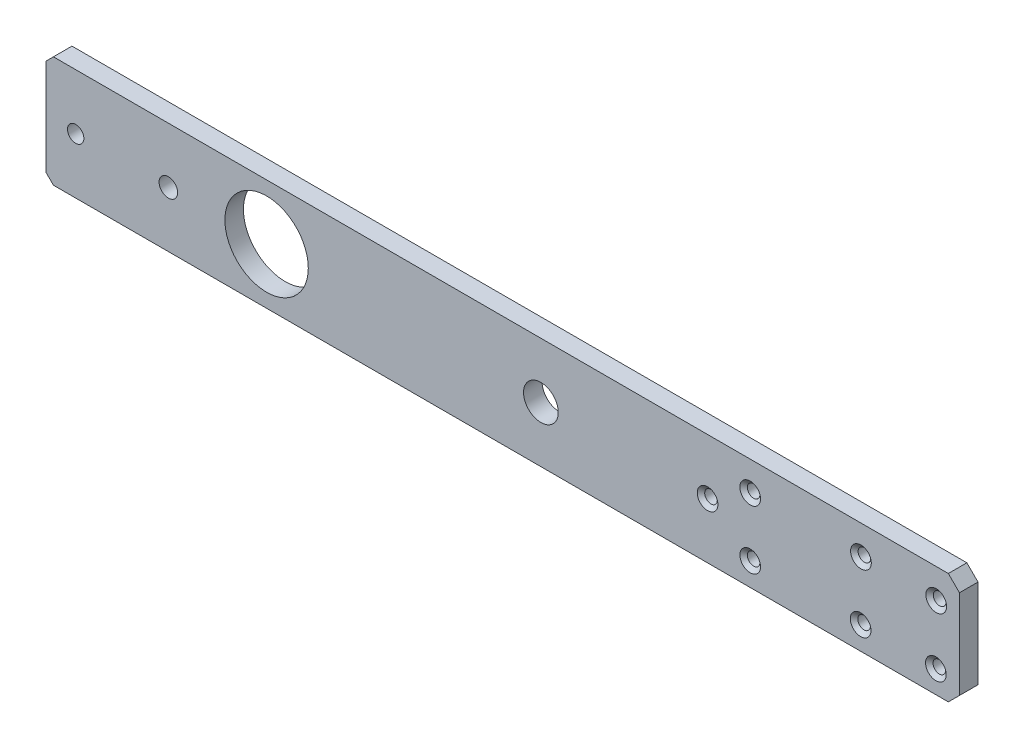
ISO-10303-21;
HEADER;
FILE_DESCRIPTION(('STEP AP214'),'2;1');
FILE_NAME('part.step','',(''),(''),'','','');
FILE_SCHEMA(('AUTOMOTIVE_DESIGN { 1 0 10303 214 1 1 1 1 }'));
ENDSEC;
DATA;
#1=APPLICATION_CONTEXT('core data for automotive mechanical design processes');
#2=APPLICATION_PROTOCOL_DEFINITION('international standard','automotive_design',2000,#1);
#3=PRODUCT_CONTEXT('',#1,'mechanical');
#4=PRODUCT('Part','Part','',(#3));
#5=PRODUCT_RELATED_PRODUCT_CATEGORY('part','',(#4));
#6=PRODUCT_DEFINITION_FORMATION('','',#4);
#7=PRODUCT_DEFINITION_CONTEXT('part definition',#1,'design');
#8=PRODUCT_DEFINITION('design','',#6,#7);
#9=PRODUCT_DEFINITION_SHAPE('','',#8);
#10=(LENGTH_UNIT() NAMED_UNIT(*) SI_UNIT(.MILLI.,.METRE.));
#11=(NAMED_UNIT(*) PLANE_ANGLE_UNIT() SI_UNIT($,.RADIAN.));
#12=(NAMED_UNIT(*) SI_UNIT($,.STERADIAN.) SOLID_ANGLE_UNIT());
#13=UNCERTAINTY_MEASURE_WITH_UNIT(LENGTH_MEASURE(1.E-05),#10,'distance_accuracy_value','');
#14=(GEOMETRIC_REPRESENTATION_CONTEXT(3) GLOBAL_UNCERTAINTY_ASSIGNED_CONTEXT((#13)) GLOBAL_UNIT_ASSIGNED_CONTEXT((#10,
#11,#12)) REPRESENTATION_CONTEXT('',''));
#15=CARTESIAN_POINT('',(0.,0.,0.));
#16=DIRECTION('',(0.,0.,1.));
#17=DIRECTION('',(1.,0.,0.));
#18=AXIS2_PLACEMENT_3D('',#15,#16,#17);
#19=CARTESIAN_POINT('',(0.,0.,3.175));
#20=DIRECTION('',(0.,0.,-1.));
#21=DIRECTION('',(-1.,0.,0.));
#22=AXIS2_PLACEMENT_3D('',#19,#20,#21);
#23=PLANE('',#22);
#24=CARTESIAN_POINT('',(93.9672182120003,0.,3.175));
#25=DIRECTION('',(0.,0.,-1.));
#26=DIRECTION('',(-1.,0.,0.));
#27=AXIS2_PLACEMENT_3D('',#24,#25,#26);
#28=CIRCLE('',#27,5.953125);
#29=CARTESIAN_POINT('',(88.0140932120003,0.,3.175));
#30=VERTEX_POINT('',#29);
#31=EDGE_CURVE('E625',#30,#30,#28,.T.);
#32=ORIENTED_EDGE('',*,*,#31,.T.);
#33=EDGE_LOOP('',(#32));
#34=FACE_BOUND('',#33,.T.);
#35=CARTESIAN_POINT('',(-33.6549999999997,0.,3.175));
#36=DIRECTION('',(0.,0.,-1.));
#37=DIRECTION('',(-1.,0.,0.));
#38=AXIS2_PLACEMENT_3D('',#35,#36,#37);
#39=CIRCLE('',#38,3.175);
#40=CARTESIAN_POINT('',(-36.8299999999997,0.,3.175));
#41=VERTEX_POINT('',#40);
#42=EDGE_CURVE('E616',#41,#41,#39,.T.);
#43=ORIENTED_EDGE('',*,*,#42,.T.);
#44=EDGE_LOOP('',(#43));
#45=FACE_BOUND('',#44,.T.);
#46=CARTESIAN_POINT('',(-65.4049999999997,0.,3.175));
#47=DIRECTION('',(0.,0.,-1.));
#48=DIRECTION('',(-1.,0.,0.));
#49=AXIS2_PLACEMENT_3D('',#46,#47,#48);
#50=CIRCLE('',#49,2.8067);
#51=CARTESIAN_POINT('',(-68.2116999999997,0.,3.175));
#52=VERTEX_POINT('',#51);
#53=EDGE_CURVE('E170',#52,#52,#50,.T.);
#54=ORIENTED_EDGE('',*,*,#53,.T.);
#55=EDGE_LOOP('',(#54));
#56=FACE_BOUND('',#55,.T.);
#57=CARTESIAN_POINT('',(203.608782335042,8.99137535087546,3.175));
#58=DIRECTION('',(0.,0.,1.));
#59=DIRECTION('',(1.,0.,0.));
#60=AXIS2_PLACEMENT_3D('',#57,#58,#59);
#61=CIRCLE('',#60,3.5433);
#62=CARTESIAN_POINT('',(207.152082335042,8.99137535087546,3.175));
#63=VERTEX_POINT('',#62);
#64=EDGE_CURVE('E172',#63,#63,#61,.T.);
#65=ORIENTED_EDGE('',*,*,#64,.F.);
#66=EDGE_LOOP('',(#65));
#67=FACE_BOUND('',#66,.T.);
#68=CARTESIAN_POINT('',(203.503161764145,-11.1439269688226,3.175));
#69=DIRECTION('',(0.,0.,1.));
#70=DIRECTION('',(1.,0.,0.));
#71=AXIS2_PLACEMENT_3D('',#68,#69,#70);
#72=CIRCLE('',#71,3.5433);
#73=CARTESIAN_POINT('',(207.046461764145,-11.1439269688226,3.175));
#74=VERTEX_POINT('',#73);
#75=EDGE_CURVE('E183',#74,#74,#72,.T.);
#76=ORIENTED_EDGE('',*,*,#75,.F.);
#77=EDGE_LOOP('',(#76));
#78=FACE_BOUND('',#77,.T.);
#79=CARTESIAN_POINT('',(229.282371238552,-11.3467989682312,3.175));
#80=DIRECTION('',(0.,0.,1.));
#81=DIRECTION('',(1.,0.,0.));
#82=AXIS2_PLACEMENT_3D('',#79,#80,#81);
#83=CIRCLE('',#82,3.5433);
#84=CARTESIAN_POINT('',(232.825671238552,-11.3467989682312,3.175));
#85=VERTEX_POINT('',#84);
#86=EDGE_CURVE('E189',#85,#85,#83,.T.);
#87=ORIENTED_EDGE('',*,*,#86,.F.);
#88=EDGE_LOOP('',(#87));
#89=FACE_BOUND('',#88,.T.);
#90=CARTESIAN_POINT('',(229.388701470581,8.92379178362501,3.175));
#91=DIRECTION('',(0.,0.,1.));
#92=DIRECTION('',(1.,0.,0.));
#93=AXIS2_PLACEMENT_3D('',#90,#91,#92);
#94=CIRCLE('',#93,3.5433);
#95=CARTESIAN_POINT('',(232.932001470581,8.92379178362501,3.175));
#96=VERTEX_POINT('',#95);
#97=EDGE_CURVE('E195',#96,#96,#94,.T.);
#98=ORIENTED_EDGE('',*,*,#97,.F.);
#99=EDGE_LOOP('',(#98));
#100=FACE_BOUND('',#99,.T.);
#101=CARTESIAN_POINT('',(165.672159691465,8.99137535087824,3.175));
#102=DIRECTION('',(0.,0.,1.));
#103=DIRECTION('',(1.,0.,0.));
#104=AXIS2_PLACEMENT_3D('',#101,#102,#103);
#105=CIRCLE('',#104,3.5433);
#106=CARTESIAN_POINT('',(169.215459691465,8.99137535087824,3.175));
#107=VERTEX_POINT('',#106);
#108=EDGE_CURVE('E201',#107,#107,#105,.T.);
#109=ORIENTED_EDGE('',*,*,#108,.F.);
#110=EDGE_LOOP('',(#109));
#111=FACE_BOUND('',#110,.T.);
#112=CARTESIAN_POINT('',(165.672159691465,-11.1439269688198,3.175));
#113=DIRECTION('',(0.,0.,1.));
#114=DIRECTION('',(1.,0.,0.));
#115=AXIS2_PLACEMENT_3D('',#112,#113,#114);
#116=CIRCLE('',#115,3.5433);
#117=CARTESIAN_POINT('',(169.215459691465,-11.1439269688198,3.175));
#118=VERTEX_POINT('',#117);
#119=EDGE_CURVE('E207',#118,#118,#116,.T.);
#120=ORIENTED_EDGE('',*,*,#119,.F.);
#121=EDGE_LOOP('',(#120));
#122=FACE_BOUND('',#121,.T.);
#123=CARTESIAN_POINT('',(151.067159691465,2.83106871279415E-12,3.175));
#124=DIRECTION('',(0.,0.,1.));
#125=DIRECTION('',(1.,0.,0.));
#126=AXIS2_PLACEMENT_3D('',#123,#124,#125);
#127=CIRCLE('',#126,3.5433);
#128=CARTESIAN_POINT('',(154.610459691465,2.83106871279415E-12,3.175));
#129=VERTEX_POINT('',#128);
#130=EDGE_CURVE('E213',#129,#129,#127,.T.);
#131=ORIENTED_EDGE('',*,*,#130,.F.);
#132=EDGE_LOOP('',(#131));
#133=FACE_BOUND('',#132,.T.);
#134=DIRECTION('',(-1.,0.,0.));
#135=VECTOR('',#134,1.);
#136=CARTESIAN_POINT('',(0.,19.05,3.175));
#137=LINE('',#136,#135);
#138=CARTESIAN_POINT('',(233.542085197356,19.0500000000001,3.175));
#139=VERTEX_POINT('',#138);
#140=CARTESIAN_POINT('',(-73.0249999999997,19.05,3.175));
#141=VERTEX_POINT('',#140);
#142=EDGE_CURVE('E119',#139,#141,#137,.T.);
#143=ORIENTED_EDGE('',*,*,#142,.T.);
#144=DIRECTION('',(-0.707106781186544,-0.707106781186551,0.));
#145=VECTOR('',#144,1.);
#146=CARTESIAN_POINT('',(-73.0249999999997,19.05,3.175));
#147=LINE('',#146,#145);
#148=CARTESIAN_POINT('',(-75.5649999999997,16.51,3.175));
#149=VERTEX_POINT('',#148);
#150=EDGE_CURVE('E142',#141,#149,#147,.T.);
#151=ORIENTED_EDGE('',*,*,#150,.T.);
#152=DIRECTION('',(0.,-1.,0.));
#153=VECTOR('',#152,1.);
#154=CARTESIAN_POINT('',(-75.5649999999997,19.05,3.175));
#155=LINE('',#154,#153);
#156=CARTESIAN_POINT('',(-75.5649999999997,-16.51,3.175));
#157=VERTEX_POINT('',#156);
#158=EDGE_CURVE('E166',#149,#157,#155,.T.);
#159=ORIENTED_EDGE('',*,*,#158,.T.);
#160=DIRECTION('',(0.707106781186551,-0.707106781186544,0.));
#161=VECTOR('',#160,1.);
#162=CARTESIAN_POINT('',(-75.5649999999997,-16.51,3.175));
#163=LINE('',#162,#161);
#164=CARTESIAN_POINT('',(-73.0249999999996,-19.05,3.175));
#165=VERTEX_POINT('',#164);
#166=EDGE_CURVE('E140',#157,#165,#163,.T.);
#167=ORIENTED_EDGE('',*,*,#166,.T.);
#168=DIRECTION('',(1.,0.,0.));
#169=VECTOR('',#168,1.);
#170=CARTESIAN_POINT('',(-28.5749999999997,-19.05,3.175));
#171=LINE('',#170,#169);
#172=CARTESIAN_POINT('',(233.542085197356,-19.05,3.175));
#173=VERTEX_POINT('',#172);
#174=EDGE_CURVE('E122',#165,#173,#171,.T.);
#175=ORIENTED_EDGE('',*,*,#174,.T.);
#176=DIRECTION('',(-0.707106781186548,-0.707106781186547,0.));
#177=VECTOR('',#176,1.);
#178=CARTESIAN_POINT('',(233.542085197356,-19.05,3.175));
#179=LINE('',#178,#177);
#180=CARTESIAN_POINT('',(237.352085197356,-15.24,3.175));
#181=VERTEX_POINT('',#180);
#182=EDGE_CURVE('E118',#173,#181,#179,.F.);
#183=ORIENTED_EDGE('',*,*,#182,.T.);
#184=DIRECTION('',(0.,-1.,0.));
#185=VECTOR('',#184,1.);
#186=CARTESIAN_POINT('',(237.352085197356,19.0500000000001,3.175));
#187=LINE('',#186,#185);
#188=CARTESIAN_POINT('',(237.352085197356,15.24,3.175));
#189=VERTEX_POINT('',#188);
#190=EDGE_CURVE('E219',#189,#181,#187,.T.);
#191=ORIENTED_EDGE('',*,*,#190,.F.);
#192=DIRECTION('',(0.707106781186547,-0.707106781186548,0.));
#193=VECTOR('',#192,1.);
#194=CARTESIAN_POINT('',(237.352085197356,15.24,3.175));
#195=LINE('',#194,#193);
#196=EDGE_CURVE('E128',#189,#139,#195,.F.);
#197=ORIENTED_EDGE('',*,*,#196,.T.);
#198=EDGE_LOOP('',(#143,#151,#159,#167,#175,#183,#191,#197));
#199=FACE_BOUND('',#198,.T.);
#200=CARTESIAN_POINT('',(0.,0.,3.175));
#201=DIRECTION('',(0.,0.,1.));
#202=DIRECTION('',(1.,0.,0.));
#203=AXIS2_PLACEMENT_3D('',#200,#201,#202);
#204=CIRCLE('',#203,14.2875);
#205=CARTESIAN_POINT('',(14.2875,0.,3.175));
#206=VERTEX_POINT('',#205);
#207=EDGE_CURVE('E103',#206,#206,#204,.T.);
#208=ORIENTED_EDGE('',*,*,#207,.F.);
#209=EDGE_LOOP('',(#208));
#210=FACE_BOUND('',#209,.T.);
#211=ADVANCED_FACE('F34',(#34,#45,#56,#67,#78,#89,#100,#111,#122,#133,#199,#210),#23,.F.);
#212=CARTESIAN_POINT('',(0.,0.,-3.175));
#213=DIRECTION('',(0.,0.,-1.));
#214=DIRECTION('',(-1.,0.,0.));
#215=AXIS2_PLACEMENT_3D('',#212,#213,#214);
#216=PLANE('',#215);
#217=CARTESIAN_POINT('',(93.9672182120003,0.,-3.175));
#218=DIRECTION('',(0.,0.,-1.));
#219=DIRECTION('',(-1.,0.,0.));
#220=AXIS2_PLACEMENT_3D('',#217,#218,#219);
#221=CIRCLE('',#220,5.953125);
#222=CARTESIAN_POINT('',(88.0140932120003,0.,-3.175));
#223=VERTEX_POINT('',#222);
#224=EDGE_CURVE('E627',#223,#223,#221,.T.);
#225=ORIENTED_EDGE('',*,*,#224,.F.);
#226=EDGE_LOOP('',(#225));
#227=FACE_BOUND('',#226,.T.);
#228=CARTESIAN_POINT('',(-33.6549999999997,0.,-3.175));
#229=DIRECTION('',(0.,0.,-1.));
#230=DIRECTION('',(-1.,0.,0.));
#231=AXIS2_PLACEMENT_3D('',#228,#229,#230);
#232=CIRCLE('',#231,3.175);
#233=CARTESIAN_POINT('',(-36.8299999999997,0.,-3.175));
#234=VERTEX_POINT('',#233);
#235=EDGE_CURVE('E620',#234,#234,#232,.T.);
#236=ORIENTED_EDGE('',*,*,#235,.F.);
#237=EDGE_LOOP('',(#236));
#238=FACE_BOUND('',#237,.T.);
#239=CARTESIAN_POINT('',(-65.4049999999997,0.,-3.175));
#240=DIRECTION('',(0.,0.,-1.));
#241=DIRECTION('',(-1.,0.,0.));
#242=AXIS2_PLACEMENT_3D('',#239,#240,#241);
#243=CIRCLE('',#242,4.8895);
#244=CARTESIAN_POINT('',(-70.2944999999996,0.,-3.175));
#245=VERTEX_POINT('',#244);
#246=EDGE_CURVE('E614',#245,#245,#243,.T.);
#247=ORIENTED_EDGE('',*,*,#246,.F.);
#248=EDGE_LOOP('',(#247));
#249=FACE_BOUND('',#248,.T.);
#250=DIRECTION('',(0.,-1.,0.));
#251=VECTOR('',#250,1.);
#252=CARTESIAN_POINT('',(-75.5649999999997,19.05,-3.175));
#253=LINE('',#252,#251);
#254=CARTESIAN_POINT('',(-75.5649999999997,16.51,-3.175));
#255=VERTEX_POINT('',#254);
#256=CARTESIAN_POINT('',(-75.5649999999997,-16.51,-3.175));
#257=VERTEX_POINT('',#256);
#258=EDGE_CURVE('E153',#255,#257,#253,.T.);
#259=ORIENTED_EDGE('',*,*,#258,.F.);
#260=DIRECTION('',(0.707106781186544,0.707106781186551,0.));
#261=VECTOR('',#260,1.);
#262=CARTESIAN_POINT('',(-46.0375000000002,46.0374999999997,-3.175));
#263=LINE('',#262,#261);
#264=CARTESIAN_POINT('',(-73.0249999999997,19.05,-3.175));
#265=VERTEX_POINT('',#264);
#266=EDGE_CURVE('E42',#255,#265,#263,.T.);
#267=ORIENTED_EDGE('',*,*,#266,.T.);
#268=DIRECTION('',(-1.,0.,0.));
#269=VECTOR('',#268,1.);
#270=CARTESIAN_POINT('',(0.,19.05,-3.175));
#271=LINE('',#270,#269);
#272=CARTESIAN_POINT('',(233.542085197356,19.0500000000001,-3.175));
#273=VERTEX_POINT('',#272);
#274=EDGE_CURVE('E102',#273,#265,#271,.T.);
#275=ORIENTED_EDGE('',*,*,#274,.F.);
#276=DIRECTION('',(-0.707106781186547,0.707106781186548,0.));
#277=VECTOR('',#276,1.);
#278=CARTESIAN_POINT('',(126.296042598678,126.296042598678,-3.175));
#279=LINE('',#278,#277);
#280=CARTESIAN_POINT('',(237.352085197356,15.24,-3.175));
#281=VERTEX_POINT('',#280);
#282=EDGE_CURVE('E114',#273,#281,#279,.F.);
#283=ORIENTED_EDGE('',*,*,#282,.T.);
#284=DIRECTION('',(0.,-1.,0.));
#285=VECTOR('',#284,1.);
#286=CARTESIAN_POINT('',(237.352085197356,19.0500000000001,-3.175));
#287=LINE('',#286,#285);
#288=CARTESIAN_POINT('',(237.352085197356,-15.24,-3.175));
#289=VERTEX_POINT('',#288);
#290=EDGE_CURVE('E111',#281,#289,#287,.T.);
#291=ORIENTED_EDGE('',*,*,#290,.T.);
#292=DIRECTION('',(0.707106781186548,0.707106781186547,0.));
#293=VECTOR('',#292,1.);
#294=CARTESIAN_POINT('',(126.296042598678,-126.296042598678,-3.175));
#295=LINE('',#294,#293);
#296=CARTESIAN_POINT('',(233.542085197356,-19.05,-3.175));
#297=VERTEX_POINT('',#296);
#298=EDGE_CURVE('E107',#289,#297,#295,.F.);
#299=ORIENTED_EDGE('',*,*,#298,.T.);
#300=DIRECTION('',(1.,0.,0.));
#301=VECTOR('',#300,1.);
#302=CARTESIAN_POINT('',(0.,-19.05,-3.175));
#303=LINE('',#302,#301);
#304=CARTESIAN_POINT('',(-73.0249999999997,-19.05,-3.175));
#305=VERTEX_POINT('',#304);
#306=EDGE_CURVE('E97',#305,#297,#303,.T.);
#307=ORIENTED_EDGE('',*,*,#306,.F.);
#308=DIRECTION('',(-0.707106781186551,0.707106781186544,0.));
#309=VECTOR('',#308,1.);
#310=CARTESIAN_POINT('',(-46.0374999999995,-46.0374999999999,-3.175));
#311=LINE('',#310,#309);
#312=EDGE_CURVE('E54',#305,#257,#311,.T.);
#313=ORIENTED_EDGE('',*,*,#312,.T.);
#314=EDGE_LOOP('',(#259,#267,#275,#283,#291,#299,#307,#313));
#315=FACE_BOUND('',#314,.T.);
#316=CARTESIAN_POINT('',(229.388701470581,8.92379178362501,-3.175));
#317=DIRECTION('',(0.,0.,1.));
#318=DIRECTION('',(1.,0.,0.));
#319=AXIS2_PLACEMENT_3D('',#316,#317,#318);
#320=CIRCLE('',#319,2.15265000000001);
#321=CARTESIAN_POINT('',(231.541351470581,8.92379178362501,-3.175));
#322=VERTEX_POINT('',#321);
#323=EDGE_CURVE('E221',#322,#322,#320,.T.);
#324=ORIENTED_EDGE('',*,*,#323,.T.);
#325=EDGE_LOOP('',(#324));
#326=FACE_BOUND('',#325,.T.);
#327=CARTESIAN_POINT('',(229.282371238552,-11.3467989682312,-3.175));
#328=DIRECTION('',(0.,0.,1.));
#329=DIRECTION('',(1.,0.,0.));
#330=AXIS2_PLACEMENT_3D('',#327,#328,#329);
#331=CIRCLE('',#330,2.15265000000001);
#332=CARTESIAN_POINT('',(231.435021238552,-11.3467989682312,-3.175));
#333=VERTEX_POINT('',#332);
#334=EDGE_CURVE('E226',#333,#333,#331,.T.);
#335=ORIENTED_EDGE('',*,*,#334,.T.);
#336=EDGE_LOOP('',(#335));
#337=FACE_BOUND('',#336,.T.);
#338=CARTESIAN_POINT('',(203.503161764145,-11.1439269688226,-3.175));
#339=DIRECTION('',(0.,0.,1.));
#340=DIRECTION('',(1.,0.,0.));
#341=AXIS2_PLACEMENT_3D('',#338,#339,#340);
#342=CIRCLE('',#341,2.15265000000001);
#343=CARTESIAN_POINT('',(205.655811764145,-11.1439269688226,-3.175));
#344=VERTEX_POINT('',#343);
#345=EDGE_CURVE('E229',#344,#344,#342,.T.);
#346=ORIENTED_EDGE('',*,*,#345,.T.);
#347=EDGE_LOOP('',(#346));
#348=FACE_BOUND('',#347,.T.);
#349=CARTESIAN_POINT('',(203.608782335042,8.99137535087546,-3.175));
#350=DIRECTION('',(0.,0.,1.));
#351=DIRECTION('',(1.,0.,0.));
#352=AXIS2_PLACEMENT_3D('',#349,#350,#351);
#353=CIRCLE('',#352,2.15265000000001);
#354=CARTESIAN_POINT('',(205.761432335042,8.99137535087546,-3.175));
#355=VERTEX_POINT('',#354);
#356=EDGE_CURVE('E232',#355,#355,#353,.T.);
#357=ORIENTED_EDGE('',*,*,#356,.T.);
#358=EDGE_LOOP('',(#357));
#359=FACE_BOUND('',#358,.T.);
#360=CARTESIAN_POINT('',(165.672159691465,8.99137535087824,-3.175));
#361=DIRECTION('',(0.,0.,1.));
#362=DIRECTION('',(1.,0.,0.));
#363=AXIS2_PLACEMENT_3D('',#360,#361,#362);
#364=CIRCLE('',#363,2.15265000000001);
#365=CARTESIAN_POINT('',(167.824809691465,8.99137535087824,-3.175));
#366=VERTEX_POINT('',#365);
#367=EDGE_CURVE('E235',#366,#366,#364,.T.);
#368=ORIENTED_EDGE('',*,*,#367,.T.);
#369=EDGE_LOOP('',(#368));
#370=FACE_BOUND('',#369,.T.);
#371=CARTESIAN_POINT('',(165.672159691465,-11.1439269688198,-3.175));
#372=DIRECTION('',(0.,0.,1.));
#373=DIRECTION('',(1.,0.,0.));
#374=AXIS2_PLACEMENT_3D('',#371,#372,#373);
#375=CIRCLE('',#374,2.15265000000001);
#376=CARTESIAN_POINT('',(167.824809691465,-11.1439269688198,-3.175));
#377=VERTEX_POINT('',#376);
#378=EDGE_CURVE('E238',#377,#377,#375,.T.);
#379=ORIENTED_EDGE('',*,*,#378,.T.);
#380=EDGE_LOOP('',(#379));
#381=FACE_BOUND('',#380,.T.);
#382=CARTESIAN_POINT('',(151.067159691465,2.83106871279415E-12,-3.175));
#383=DIRECTION('',(0.,0.,1.));
#384=DIRECTION('',(1.,0.,0.));
#385=AXIS2_PLACEMENT_3D('',#382,#383,#384);
#386=CIRCLE('',#385,2.15265000000001);
#387=CARTESIAN_POINT('',(153.219809691465,2.83106871279415E-12,-3.175));
#388=VERTEX_POINT('',#387);
#389=EDGE_CURVE('E241',#388,#388,#386,.T.);
#390=ORIENTED_EDGE('',*,*,#389,.T.);
#391=EDGE_LOOP('',(#390));
#392=FACE_BOUND('',#391,.T.);
#393=CARTESIAN_POINT('',(0.,0.,-3.175));
#394=DIRECTION('',(0.,0.,1.));
#395=DIRECTION('',(1.,0.,0.));
#396=AXIS2_PLACEMENT_3D('',#393,#394,#395);
#397=CIRCLE('',#396,14.2875);
#398=CARTESIAN_POINT('',(14.2875,0.,-3.175));
#399=VERTEX_POINT('',#398);
#400=EDGE_CURVE('E244',#399,#399,#397,.T.);
#401=ORIENTED_EDGE('',*,*,#400,.T.);
#402=EDGE_LOOP('',(#401));
#403=FACE_BOUND('',#402,.T.);
#404=ADVANCED_FACE('F108',(#227,#238,#249,#315,#326,#337,#348,#359,#370,#381,#392,#403),#216,.T.);
#405=CARTESIAN_POINT('',(0.,-19.05,3.175));
#406=DIRECTION('',(0.,1.,0.));
#407=DIRECTION('',(0.,0.,1.));
#408=AXIS2_PLACEMENT_3D('',#405,#406,#407);
#409=PLANE('',#408);
#410=ORIENTED_EDGE('',*,*,#174,.F.);
#411=DIRECTION('',(0.,0.,-1.));
#412=VECTOR('',#411,1.);
#413=CARTESIAN_POINT('',(-73.0249999999997,-19.05,-3.175));
#414=LINE('',#413,#412);
#415=EDGE_CURVE('E11',#165,#305,#414,.T.);
#416=ORIENTED_EDGE('',*,*,#415,.T.);
#417=ORIENTED_EDGE('',*,*,#306,.T.);
#418=DIRECTION('',(0.,0.,1.));
#419=VECTOR('',#418,1.);
#420=CARTESIAN_POINT('',(233.542085197356,-19.05,3.175));
#421=LINE('',#420,#419);
#422=EDGE_CURVE('E101',#297,#173,#421,.T.);
#423=ORIENTED_EDGE('',*,*,#422,.T.);
#424=EDGE_LOOP('',(#410,#416,#417,#423));
#425=FACE_BOUND('',#424,.T.);
#426=ADVANCED_FACE('F99',(#425),#409,.F.);
#427=CARTESIAN_POINT('',(0.,19.05,3.175));
#428=DIRECTION('',(0.,-1.,0.));
#429=DIRECTION('',(1.,0.,0.));
#430=AXIS2_PLACEMENT_3D('',#427,#428,#429);
#431=PLANE('',#430);
#432=ORIENTED_EDGE('',*,*,#274,.T.);
#433=DIRECTION('',(0.,0.,1.));
#434=VECTOR('',#433,1.);
#435=CARTESIAN_POINT('',(-73.0249999999997,19.05,3.175));
#436=LINE('',#435,#434);
#437=EDGE_CURVE('E137',#265,#141,#436,.T.);
#438=ORIENTED_EDGE('',*,*,#437,.T.);
#439=ORIENTED_EDGE('',*,*,#142,.F.);
#440=DIRECTION('',(0.,0.,-1.));
#441=VECTOR('',#440,1.);
#442=CARTESIAN_POINT('',(233.542085197356,19.0500000000001,3.175));
#443=LINE('',#442,#441);
#444=EDGE_CURVE('E130',#139,#273,#443,.T.);
#445=ORIENTED_EDGE('',*,*,#444,.T.);
#446=EDGE_LOOP('',(#432,#438,#439,#445));
#447=FACE_BOUND('',#446,.T.);
#448=ADVANCED_FACE('F158',(#447),#431,.F.);
#449=CARTESIAN_POINT('',(0.,0.,3.175));
#450=DIRECTION('',(0.,0.,-1.));
#451=DIRECTION('',(-1.,0.,0.));
#452=AXIS2_PLACEMENT_3D('',#449,#450,#451);
#453=CYLINDRICAL_SURFACE('',#452,14.2875);
#454=ORIENTED_EDGE('',*,*,#207,.T.);
#455=EDGE_LOOP('',(#454));
#456=FACE_BOUND('',#455,.T.);
#457=ORIENTED_EDGE('',*,*,#400,.F.);
#458=EDGE_LOOP('',(#457));
#459=FACE_BOUND('',#458,.T.);
#460=ADVANCED_FACE('F271',(#456,#459),#453,.F.);
#461=CARTESIAN_POINT('',(151.067159691465,2.83106871279415E-12,3.175));
#462=DIRECTION('',(0.,0.,1.));
#463=DIRECTION('',(1.,0.,0.));
#464=AXIS2_PLACEMENT_3D('',#461,#462,#463);
#465=CYLINDRICAL_SURFACE('',#464,2.15265000000001);
#466=CARTESIAN_POINT('',(151.067159691465,2.83106871279415E-12,2.00810609790332));
#467=DIRECTION('',(0.,0.,1.));
#468=DIRECTION('',(1.,0.,0.));
#469=AXIS2_PLACEMENT_3D('',#466,#467,#468);
#470=CIRCLE('',#469,2.15264999999998);
#471=CARTESIAN_POINT('',(153.219809691465,2.83106871279415E-12,2.00810609790332));
#472=VERTEX_POINT('',#471);
#473=EDGE_CURVE('E216',#472,#472,#470,.T.);
#474=ORIENTED_EDGE('',*,*,#473,.T.);
#475=EDGE_LOOP('',(#474));
#476=FACE_BOUND('',#475,.T.);
#477=ORIENTED_EDGE('',*,*,#389,.F.);
#478=EDGE_LOOP('',(#477));
#479=FACE_BOUND('',#478,.T.);
#480=ADVANCED_FACE('F326',(#476,#479),#465,.F.);
#481=CARTESIAN_POINT('',(165.672159691465,-11.1439269688198,3.175));
#482=DIRECTION('',(0.,0.,1.));
#483=DIRECTION('',(1.,0.,0.));
#484=AXIS2_PLACEMENT_3D('',#481,#482,#483);
#485=CYLINDRICAL_SURFACE('',#484,2.15265000000001);
#486=CARTESIAN_POINT('',(165.672159691465,-11.1439269688198,2.00810609790332));
#487=DIRECTION('',(0.,0.,1.));
#488=DIRECTION('',(1.,0.,0.));
#489=AXIS2_PLACEMENT_3D('',#486,#487,#488);
#490=CIRCLE('',#489,2.15264999999998);
#491=CARTESIAN_POINT('',(167.824809691465,-11.1439269688198,2.00810609790332));
#492=VERTEX_POINT('',#491);
#493=EDGE_CURVE('E210',#492,#492,#490,.T.);
#494=ORIENTED_EDGE('',*,*,#493,.T.);
#495=EDGE_LOOP('',(#494));
#496=FACE_BOUND('',#495,.T.);
#497=ORIENTED_EDGE('',*,*,#378,.F.);
#498=EDGE_LOOP('',(#497));
#499=FACE_BOUND('',#498,.T.);
#500=ADVANCED_FACE('F323',(#496,#499),#485,.F.);
#501=CARTESIAN_POINT('',(165.672159691465,8.99137535087824,3.175));
#502=DIRECTION('',(0.,0.,1.));
#503=DIRECTION('',(1.,0.,0.));
#504=AXIS2_PLACEMENT_3D('',#501,#502,#503);
#505=CYLINDRICAL_SURFACE('',#504,2.15265000000001);
#506=CARTESIAN_POINT('',(165.672159691465,8.99137535087824,2.00810609790332));
#507=DIRECTION('',(0.,0.,1.));
#508=DIRECTION('',(1.,0.,0.));
#509=AXIS2_PLACEMENT_3D('',#506,#507,#508);
#510=CIRCLE('',#509,2.15264999999998);
#511=CARTESIAN_POINT('',(167.824809691465,8.99137535087824,2.00810609790332));
#512=VERTEX_POINT('',#511);
#513=EDGE_CURVE('E204',#512,#512,#510,.T.);
#514=ORIENTED_EDGE('',*,*,#513,.T.);
#515=EDGE_LOOP('',(#514));
#516=FACE_BOUND('',#515,.T.);
#517=ORIENTED_EDGE('',*,*,#367,.F.);
#518=EDGE_LOOP('',(#517));
#519=FACE_BOUND('',#518,.T.);
#520=ADVANCED_FACE('F319',(#516,#519),#505,.F.);
#521=CARTESIAN_POINT('',(203.608782335042,8.99137535087546,3.175));
#522=DIRECTION('',(0.,0.,1.));
#523=DIRECTION('',(1.,0.,0.));
#524=AXIS2_PLACEMENT_3D('',#521,#522,#523);
#525=CYLINDRICAL_SURFACE('',#524,2.15265000000001);
#526=CARTESIAN_POINT('',(203.608782335042,8.99137535087546,2.00810609790332));
#527=DIRECTION('',(0.,0.,1.));
#528=DIRECTION('',(1.,0.,0.));
#529=AXIS2_PLACEMENT_3D('',#526,#527,#528);
#530=CIRCLE('',#529,2.15264999999998);
#531=CARTESIAN_POINT('',(205.761432335042,8.99137535087546,2.00810609790332));
#532=VERTEX_POINT('',#531);
#533=EDGE_CURVE('E180',#532,#532,#530,.T.);
#534=ORIENTED_EDGE('',*,*,#533,.T.);
#535=EDGE_LOOP('',(#534));
#536=FACE_BOUND('',#535,.T.);
#537=ORIENTED_EDGE('',*,*,#356,.F.);
#538=EDGE_LOOP('',(#537));
#539=FACE_BOUND('',#538,.T.);
#540=ADVANCED_FACE('F315',(#536,#539),#525,.F.);
#541=CARTESIAN_POINT('',(203.503161764145,-11.1439269688226,3.175));
#542=DIRECTION('',(0.,0.,1.));
#543=DIRECTION('',(1.,0.,0.));
#544=AXIS2_PLACEMENT_3D('',#541,#542,#543);
#545=CYLINDRICAL_SURFACE('',#544,2.15265000000001);
#546=CARTESIAN_POINT('',(203.503161764145,-11.1439269688226,2.00810609790332));
#547=DIRECTION('',(0.,0.,1.));
#548=DIRECTION('',(1.,0.,0.));
#549=AXIS2_PLACEMENT_3D('',#546,#547,#548);
#550=CIRCLE('',#549,2.15264999999998);
#551=CARTESIAN_POINT('',(205.655811764145,-11.1439269688226,2.00810609790332));
#552=VERTEX_POINT('',#551);
#553=EDGE_CURVE('E186',#552,#552,#550,.T.);
#554=ORIENTED_EDGE('',*,*,#553,.T.);
#555=EDGE_LOOP('',(#554));
#556=FACE_BOUND('',#555,.T.);
#557=ORIENTED_EDGE('',*,*,#345,.F.);
#558=EDGE_LOOP('',(#557));
#559=FACE_BOUND('',#558,.T.);
#560=ADVANCED_FACE('F311',(#556,#559),#545,.F.);
#561=CARTESIAN_POINT('',(229.282371238552,-11.3467989682312,3.175));
#562=DIRECTION('',(0.,0.,1.));
#563=DIRECTION('',(1.,0.,0.));
#564=AXIS2_PLACEMENT_3D('',#561,#562,#563);
#565=CYLINDRICAL_SURFACE('',#564,2.15265000000001);
#566=CARTESIAN_POINT('',(229.282371238552,-11.3467989682312,2.00810609790332));
#567=DIRECTION('',(0.,0.,1.));
#568=DIRECTION('',(1.,0.,0.));
#569=AXIS2_PLACEMENT_3D('',#566,#567,#568);
#570=CIRCLE('',#569,2.15264999999998);
#571=CARTESIAN_POINT('',(231.435021238552,-11.3467989682312,2.00810609790332));
#572=VERTEX_POINT('',#571);
#573=EDGE_CURVE('E192',#572,#572,#570,.T.);
#574=ORIENTED_EDGE('',*,*,#573,.T.);
#575=EDGE_LOOP('',(#574));
#576=FACE_BOUND('',#575,.T.);
#577=ORIENTED_EDGE('',*,*,#334,.F.);
#578=EDGE_LOOP('',(#577));
#579=FACE_BOUND('',#578,.T.);
#580=ADVANCED_FACE('F307',(#576,#579),#565,.F.);
#581=CARTESIAN_POINT('',(229.388701470581,8.92379178362501,3.175));
#582=DIRECTION('',(0.,0.,1.));
#583=DIRECTION('',(1.,0.,0.));
#584=AXIS2_PLACEMENT_3D('',#581,#582,#583);
#585=CYLINDRICAL_SURFACE('',#584,2.15265000000001);
#586=CARTESIAN_POINT('',(229.388701470581,8.92379178362501,2.00810609790332));
#587=DIRECTION('',(0.,0.,1.));
#588=DIRECTION('',(1.,0.,0.));
#589=AXIS2_PLACEMENT_3D('',#586,#587,#588);
#590=CIRCLE('',#589,2.15264999999998);
#591=CARTESIAN_POINT('',(231.541351470581,8.92379178362501,2.00810609790332));
#592=VERTEX_POINT('',#591);
#593=EDGE_CURVE('E198',#592,#592,#590,.T.);
#594=ORIENTED_EDGE('',*,*,#593,.T.);
#595=EDGE_LOOP('',(#594));
#596=FACE_BOUND('',#595,.T.);
#597=ORIENTED_EDGE('',*,*,#323,.F.);
#598=EDGE_LOOP('',(#597));
#599=FACE_BOUND('',#598,.T.);
#600=ADVANCED_FACE('F303',(#596,#599),#585,.F.);
#601=CARTESIAN_POINT('',(237.352085197356,19.0500000000001,-3.175));
#602=DIRECTION('',(-1.,0.,0.));
#603=DIRECTION('',(0.,-1.,0.));
#604=AXIS2_PLACEMENT_3D('',#601,#602,#603);
#605=PLANE('',#604);
#606=ORIENTED_EDGE('',*,*,#290,.F.);
#607=DIRECTION('',(0.,0.,1.));
#608=VECTOR('',#607,1.);
#609=CARTESIAN_POINT('',(237.352085197356,15.24,-3.175));
#610=LINE('',#609,#608);
#611=EDGE_CURVE('E134',#281,#189,#610,.T.);
#612=ORIENTED_EDGE('',*,*,#611,.T.);
#613=ORIENTED_EDGE('',*,*,#190,.T.);
#614=DIRECTION('',(0.,0.,-1.));
#615=VECTOR('',#614,1.);
#616=CARTESIAN_POINT('',(237.352085197356,-15.24,-3.175));
#617=LINE('',#616,#615);
#618=EDGE_CURVE('E132',#181,#289,#617,.T.);
#619=ORIENTED_EDGE('',*,*,#618,.T.);
#620=EDGE_LOOP('',(#606,#612,#613,#619));
#621=FACE_BOUND('',#620,.T.);
#622=ADVANCED_FACE('F281',(#621),#605,.F.);
#623=CARTESIAN_POINT('',(237.352085197356,15.24,-3.175));
#624=DIRECTION('',(-0.707106781186548,-0.707106781186547,0.));
#625=DIRECTION('',(0.,0.,1.));
#626=AXIS2_PLACEMENT_3D('',#623,#624,#625);
#627=PLANE('',#626);
#628=ORIENTED_EDGE('',*,*,#282,.F.);
#629=ORIENTED_EDGE('',*,*,#444,.F.);
#630=ORIENTED_EDGE('',*,*,#196,.F.);
#631=ORIENTED_EDGE('',*,*,#611,.F.);
#632=EDGE_LOOP('',(#628,#629,#630,#631));
#633=FACE_BOUND('',#632,.T.);
#634=ADVANCED_FACE('F278',(#633),#627,.F.);
#635=CARTESIAN_POINT('',(233.542085197356,-19.05,3.175));
#636=DIRECTION('',(-0.707106781186547,0.707106781186548,0.));
#637=DIRECTION('',(0.,0.,1.));
#638=AXIS2_PLACEMENT_3D('',#635,#636,#637);
#639=PLANE('',#638);
#640=ORIENTED_EDGE('',*,*,#298,.F.);
#641=ORIENTED_EDGE('',*,*,#618,.F.);
#642=ORIENTED_EDGE('',*,*,#182,.F.);
#643=ORIENTED_EDGE('',*,*,#422,.F.);
#644=EDGE_LOOP('',(#640,#641,#642,#643));
#645=FACE_BOUND('',#644,.T.);
#646=ADVANCED_FACE('F117',(#645),#639,.F.);
#647=CARTESIAN_POINT('',(151.067159691465,2.83106871279415E-12,3.175));
#648=DIRECTION('',(0.,0.,1.));
#649=DIRECTION('',(1.,0.,0.));
#650=AXIS2_PLACEMENT_3D('',#647,#648,#649);
#651=CONICAL_SURFACE('',#650,3.5433,0.872664625997175);
#652=ORIENTED_EDGE('',*,*,#473,.F.);
#653=EDGE_LOOP('',(#652));
#654=FACE_BOUND('',#653,.T.);
#655=ORIENTED_EDGE('',*,*,#130,.T.);
#656=EDGE_LOOP('',(#655));
#657=FACE_BOUND('',#656,.T.);
#658=ADVANCED_FACE('F284',(#654,#657),#651,.F.);
#659=CARTESIAN_POINT('',(165.672159691465,-11.1439269688198,3.175));
#660=DIRECTION('',(0.,0.,1.));
#661=DIRECTION('',(1.,0.,0.));
#662=AXIS2_PLACEMENT_3D('',#659,#660,#661);
#663=CONICAL_SURFACE('',#662,3.5433,0.872664625997175);
#664=ORIENTED_EDGE('',*,*,#493,.F.);
#665=EDGE_LOOP('',(#664));
#666=FACE_BOUND('',#665,.T.);
#667=ORIENTED_EDGE('',*,*,#119,.T.);
#668=EDGE_LOOP('',(#667));
#669=FACE_BOUND('',#668,.T.);
#670=ADVANCED_FACE('F288',(#666,#669),#663,.F.);
#671=CARTESIAN_POINT('',(165.672159691465,8.99137535087824,3.175));
#672=DIRECTION('',(0.,0.,1.));
#673=DIRECTION('',(1.,0.,0.));
#674=AXIS2_PLACEMENT_3D('',#671,#672,#673);
#675=CONICAL_SURFACE('',#674,3.5433,0.872664625997175);
#676=ORIENTED_EDGE('',*,*,#513,.F.);
#677=EDGE_LOOP('',(#676));
#678=FACE_BOUND('',#677,.T.);
#679=ORIENTED_EDGE('',*,*,#108,.T.);
#680=EDGE_LOOP('',(#679));
#681=FACE_BOUND('',#680,.T.);
#682=ADVANCED_FACE('F294',(#678,#681),#675,.F.);
#683=CARTESIAN_POINT('',(229.388701470581,8.92379178362501,3.175));
#684=DIRECTION('',(0.,0.,1.));
#685=DIRECTION('',(1.,0.,0.));
#686=AXIS2_PLACEMENT_3D('',#683,#684,#685);
#687=CONICAL_SURFACE('',#686,3.5433,0.872664625997175);
#688=ORIENTED_EDGE('',*,*,#593,.F.);
#689=EDGE_LOOP('',(#688));
#690=FACE_BOUND('',#689,.T.);
#691=ORIENTED_EDGE('',*,*,#97,.T.);
#692=EDGE_LOOP('',(#691));
#693=FACE_BOUND('',#692,.T.);
#694=ADVANCED_FACE('F446',(#690,#693),#687,.F.);
#695=CARTESIAN_POINT('',(229.282371238552,-11.3467989682312,3.175));
#696=DIRECTION('',(0.,0.,1.));
#697=DIRECTION('',(1.,0.,0.));
#698=AXIS2_PLACEMENT_3D('',#695,#696,#697);
#699=CONICAL_SURFACE('',#698,3.5433,0.872664625997175);
#700=ORIENTED_EDGE('',*,*,#573,.F.);
#701=EDGE_LOOP('',(#700));
#702=FACE_BOUND('',#701,.T.);
#703=ORIENTED_EDGE('',*,*,#86,.T.);
#704=EDGE_LOOP('',(#703));
#705=FACE_BOUND('',#704,.T.);
#706=ADVANCED_FACE('F438',(#702,#705),#699,.F.);
#707=CARTESIAN_POINT('',(203.503161764145,-11.1439269688226,3.175));
#708=DIRECTION('',(0.,0.,1.));
#709=DIRECTION('',(1.,0.,0.));
#710=AXIS2_PLACEMENT_3D('',#707,#708,#709);
#711=CONICAL_SURFACE('',#710,3.5433,0.872664625997175);
#712=ORIENTED_EDGE('',*,*,#553,.F.);
#713=EDGE_LOOP('',(#712));
#714=FACE_BOUND('',#713,.T.);
#715=ORIENTED_EDGE('',*,*,#75,.T.);
#716=EDGE_LOOP('',(#715));
#717=FACE_BOUND('',#716,.T.);
#718=ADVANCED_FACE('F430',(#714,#717),#711,.F.);
#719=CARTESIAN_POINT('',(203.608782335042,8.99137535087546,3.175));
#720=DIRECTION('',(0.,0.,1.));
#721=DIRECTION('',(1.,0.,0.));
#722=AXIS2_PLACEMENT_3D('',#719,#720,#721);
#723=CONICAL_SURFACE('',#722,3.5433,0.872664625997175);
#724=ORIENTED_EDGE('',*,*,#533,.F.);
#725=EDGE_LOOP('',(#724));
#726=FACE_BOUND('',#725,.T.);
#727=ORIENTED_EDGE('',*,*,#64,.T.);
#728=EDGE_LOOP('',(#727));
#729=FACE_BOUND('',#728,.T.);
#730=ADVANCED_FACE('F422',(#726,#729),#723,.F.);
#731=CARTESIAN_POINT('',(-75.5649999999997,19.05,-3.175));
#732=DIRECTION('',(-1.,0.,0.));
#733=DIRECTION('',(0.,0.,1.));
#734=AXIS2_PLACEMENT_3D('',#731,#732,#733);
#735=PLANE('',#734);
#736=ORIENTED_EDGE('',*,*,#158,.F.);
#737=DIRECTION('',(0.,0.,-1.));
#738=VECTOR('',#737,1.);
#739=CARTESIAN_POINT('',(-75.5649999999997,16.51,-3.175));
#740=LINE('',#739,#738);
#741=EDGE_CURVE('E147',#149,#255,#740,.T.);
#742=ORIENTED_EDGE('',*,*,#741,.T.);
#743=ORIENTED_EDGE('',*,*,#258,.T.);
#744=DIRECTION('',(0.,0.,1.));
#745=VECTOR('',#744,1.);
#746=CARTESIAN_POINT('',(-75.5649999999997,-16.51,3.175));
#747=LINE('',#746,#745);
#748=EDGE_CURVE('E144',#257,#157,#747,.T.);
#749=ORIENTED_EDGE('',*,*,#748,.T.);
#750=EDGE_LOOP('',(#736,#742,#743,#749));
#751=FACE_BOUND('',#750,.T.);
#752=ADVANCED_FACE('F168',(#751),#735,.T.);
#753=CARTESIAN_POINT('',(-73.0249999999997,19.05,3.175));
#754=DIRECTION('',(-0.707106781186551,0.707106781186544,0.));
#755=DIRECTION('',(0.,0.,-1.));
#756=AXIS2_PLACEMENT_3D('',#753,#754,#755);
#757=PLANE('',#756);
#758=ORIENTED_EDGE('',*,*,#266,.F.);
#759=ORIENTED_EDGE('',*,*,#741,.F.);
#760=ORIENTED_EDGE('',*,*,#150,.F.);
#761=ORIENTED_EDGE('',*,*,#437,.F.);
#762=EDGE_LOOP('',(#758,#759,#760,#761));
#763=FACE_BOUND('',#762,.T.);
#764=ADVANCED_FACE('F161',(#763),#757,.T.);
#765=CARTESIAN_POINT('',(-75.5649999999997,-16.51,-3.175));
#766=DIRECTION('',(-0.707106781186544,-0.707106781186551,0.));
#767=DIRECTION('',(0.,0.,-1.));
#768=AXIS2_PLACEMENT_3D('',#765,#766,#767);
#769=PLANE('',#768);
#770=ORIENTED_EDGE('',*,*,#312,.F.);
#771=ORIENTED_EDGE('',*,*,#415,.F.);
#772=ORIENTED_EDGE('',*,*,#166,.F.);
#773=ORIENTED_EDGE('',*,*,#748,.F.);
#774=EDGE_LOOP('',(#770,#771,#772,#773));
#775=FACE_BOUND('',#774,.T.);
#776=ADVANCED_FACE('F36',(#775),#769,.T.);
#777=CARTESIAN_POINT('',(-65.4049999999997,0.,-3.175));
#778=DIRECTION('',(0.,0.,-1.));
#779=DIRECTION('',(-1.,0.,0.));
#780=AXIS2_PLACEMENT_3D('',#777,#778,#779);
#781=CYLINDRICAL_SURFACE('',#780,2.8067);
#782=ORIENTED_EDGE('',*,*,#53,.F.);
#783=EDGE_LOOP('',(#782));
#784=FACE_BOUND('',#783,.T.);
#785=CARTESIAN_POINT('',(-65.4049999999997,0.,-1.42732328818396));
#786=DIRECTION('',(0.,0.,-1.));
#787=DIRECTION('',(-1.,0.,0.));
#788=AXIS2_PLACEMENT_3D('',#785,#786,#787);
#789=CIRCLE('',#788,2.8067);
#790=CARTESIAN_POINT('',(-68.2116999999997,0.,-1.42732328818396));
#791=VERTEX_POINT('',#790);
#792=EDGE_CURVE('E175',#791,#791,#789,.T.);
#793=ORIENTED_EDGE('',*,*,#792,.T.);
#794=EDGE_LOOP('',(#793));
#795=FACE_BOUND('',#794,.T.);
#796=ADVANCED_FACE('F252',(#784,#795),#781,.F.);
#797=CARTESIAN_POINT('',(-65.4049999999997,0.,-3.175));
#798=DIRECTION('',(0.,0.,-1.));
#799=DIRECTION('',(-1.,0.,0.));
#800=AXIS2_PLACEMENT_3D('',#797,#798,#799);
#801=CONICAL_SURFACE('',#800,4.8895,0.872664625997165);
#802=ORIENTED_EDGE('',*,*,#792,.F.);
#803=EDGE_LOOP('',(#802));
#804=FACE_BOUND('',#803,.T.);
#805=ORIENTED_EDGE('',*,*,#246,.T.);
#806=EDGE_LOOP('',(#805));
#807=FACE_BOUND('',#806,.T.);
#808=ADVANCED_FACE('F257',(#804,#807),#801,.F.);
#809=CARTESIAN_POINT('',(-33.6549999999997,0.,-3.175));
#810=DIRECTION('',(0.,0.,-1.));
#811=DIRECTION('',(-1.,0.,0.));
#812=AXIS2_PLACEMENT_3D('',#809,#810,#811);
#813=CYLINDRICAL_SURFACE('',#812,3.175);
#814=ORIENTED_EDGE('',*,*,#42,.F.);
#815=EDGE_LOOP('',(#814));
#816=FACE_BOUND('',#815,.T.);
#817=ORIENTED_EDGE('',*,*,#235,.T.);
#818=EDGE_LOOP('',(#817));
#819=FACE_BOUND('',#818,.T.);
#820=ADVANCED_FACE('F372',(#816,#819),#813,.F.);
#821=CARTESIAN_POINT('',(93.9672182120003,0.,-3.175));
#822=DIRECTION('',(0.,0.,-1.));
#823=DIRECTION('',(-1.,0.,0.));
#824=AXIS2_PLACEMENT_3D('',#821,#822,#823);
#825=CYLINDRICAL_SURFACE('',#824,5.953125);
#826=ORIENTED_EDGE('',*,*,#31,.F.);
#827=EDGE_LOOP('',(#826));
#828=FACE_BOUND('',#827,.T.);
#829=ORIENTED_EDGE('',*,*,#224,.T.);
#830=EDGE_LOOP('',(#829));
#831=FACE_BOUND('',#830,.T.);
#832=ADVANCED_FACE('F367',(#828,#831),#825,.F.);
#833=CLOSED_SHELL('',(#211,#404,#426,#448,#460,#480,#500,#520,#540,#560,#580,#600,#622,#634,
#646,#658,#670,#682,#694,#706,#718,#730,#752,#764,#776,#796,#808,#820,#832));
#834=MANIFOLD_SOLID_BREP('B2',#833);
#835=ADVANCED_BREP_SHAPE_REPRESENTATION('',(#18,#834),#14);
#836=SHAPE_DEFINITION_REPRESENTATION(#9,#835);
ENDSEC;
END-ISO-10303-21;
